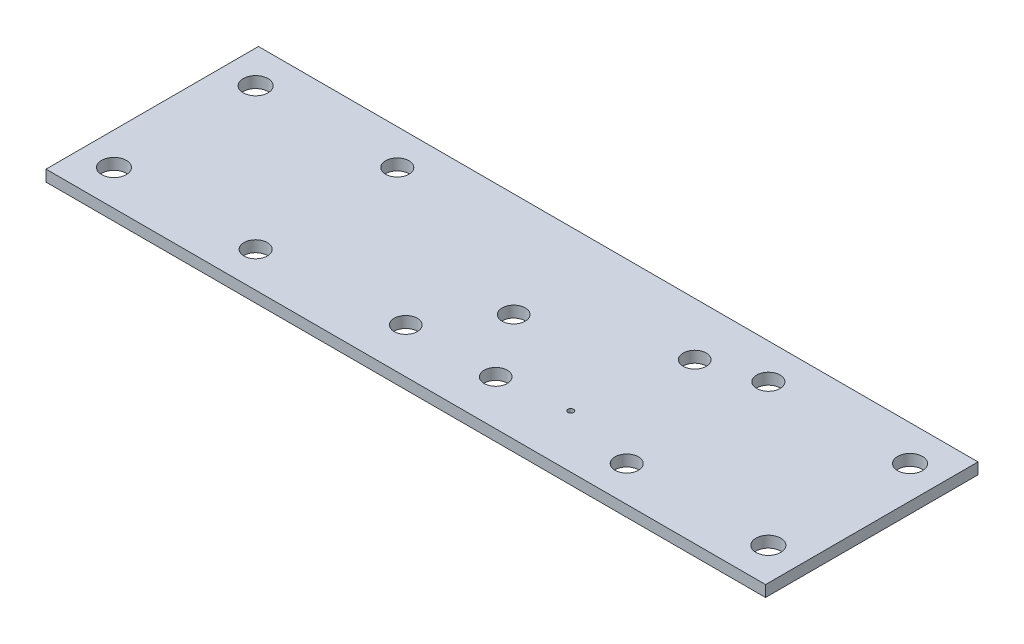
ISO-10303-21;
HEADER;
FILE_DESCRIPTION(('STEP AP214'),'2;1');
FILE_NAME('part.step','',(''),(''),'','','');
FILE_SCHEMA(('AUTOMOTIVE_DESIGN { 1 0 10303 214 1 1 1 1 }'));
ENDSEC;
DATA;
#1=APPLICATION_CONTEXT('core data for automotive mechanical design processes');
#2=APPLICATION_PROTOCOL_DEFINITION('international standard','automotive_design',2000,#1);
#3=PRODUCT_CONTEXT('',#1,'mechanical');
#4=PRODUCT('Part','Part','',(#3));
#5=PRODUCT_RELATED_PRODUCT_CATEGORY('part','',(#4));
#6=PRODUCT_DEFINITION_FORMATION('','',#4);
#7=PRODUCT_DEFINITION_CONTEXT('part definition',#1,'design');
#8=PRODUCT_DEFINITION('design','',#6,#7);
#9=PRODUCT_DEFINITION_SHAPE('','',#8);
#10=(LENGTH_UNIT() NAMED_UNIT(*) SI_UNIT(.MILLI.,.METRE.));
#11=(NAMED_UNIT(*) PLANE_ANGLE_UNIT() SI_UNIT($,.RADIAN.));
#12=(NAMED_UNIT(*) SI_UNIT($,.STERADIAN.) SOLID_ANGLE_UNIT());
#13=UNCERTAINTY_MEASURE_WITH_UNIT(LENGTH_MEASURE(1.E-05),#10,'distance_accuracy_value','');
#14=(GEOMETRIC_REPRESENTATION_CONTEXT(3) GLOBAL_UNCERTAINTY_ASSIGNED_CONTEXT((#13)) GLOBAL_UNIT_ASSIGNED_CONTEXT((#10,
#11,#12)) REPRESENTATION_CONTEXT('',''));
#15=CARTESIAN_POINT('',(0.,0.,0.));
#16=DIRECTION('',(0.,0.,1.));
#17=DIRECTION('',(1.,0.,0.));
#18=AXIS2_PLACEMENT_3D('',#15,#16,#17);
#19=CARTESIAN_POINT('',(0.,3.175,0.));
#20=DIRECTION('',(0.,1.,0.));
#21=DIRECTION('',(0.,0.,1.));
#22=AXIS2_PLACEMENT_3D('',#19,#20,#21);
#23=PLANE('',#22);
#24=CARTESIAN_POINT('',(36.6,3.175,-15.));
#25=DIRECTION('',(0.,1.,0.));
#26=DIRECTION('',(0.,0.,1.));
#27=AXIS2_PLACEMENT_3D('',#24,#25,#26);
#28=CIRCLE('',#27,3.2639);
#29=CARTESIAN_POINT('',(36.6,3.175,-11.7361));
#30=VERTEX_POINT('',#29);
#31=EDGE_CURVE('E184',#30,#30,#28,.T.);
#32=ORIENTED_EDGE('',*,*,#31,.F.);
#33=EDGE_LOOP('',(#32));
#34=FACE_BOUND('',#33,.T.);
#35=CARTESIAN_POINT('',(31.6,3.175,15.));
#36=DIRECTION('',(0.,1.,0.));
#37=DIRECTION('',(0.,0.,1.));
#38=AXIS2_PLACEMENT_3D('',#35,#36,#37);
#39=CIRCLE('',#38,0.793749999999992);
#40=CARTESIAN_POINT('',(31.6,3.175,15.79375));
#41=VERTEX_POINT('',#40);
#42=EDGE_CURVE('E178',#41,#41,#39,.T.);
#43=ORIENTED_EDGE('',*,*,#42,.F.);
#44=EDGE_LOOP('',(#43));
#45=FACE_BOUND('',#44,.T.);
#46=CARTESIAN_POINT('',(12.7,3.175,17.3));
#47=DIRECTION('',(0.,1.,0.));
#48=DIRECTION('',(0.,0.,1.));
#49=AXIS2_PLACEMENT_3D('',#46,#47,#48);
#50=CIRCLE('',#49,3.2639);
#51=CARTESIAN_POINT('',(12.7,3.175,20.5639));
#52=VERTEX_POINT('',#51);
#53=EDGE_CURVE('E173',#52,#52,#50,.T.);
#54=ORIENTED_EDGE('',*,*,#53,.F.);
#55=EDGE_LOOP('',(#54));
#56=FACE_BOUND('',#55,.T.);
#57=CARTESIAN_POINT('',(0.,3.175,-0.479999999999982));
#58=DIRECTION('',(0.,1.,0.));
#59=DIRECTION('',(0.,0.,1.));
#60=AXIS2_PLACEMENT_3D('',#57,#58,#59);
#61=CIRCLE('',#60,3.2639);
#62=CARTESIAN_POINT('',(0.,3.175,2.78390000000002));
#63=VERTEX_POINT('',#62);
#64=EDGE_CURVE('E166',#63,#63,#61,.T.);
#65=ORIENTED_EDGE('',*,*,#64,.F.);
#66=EDGE_LOOP('',(#65));
#67=FACE_BOUND('',#66,.T.);
#68=CARTESIAN_POINT('',(-12.7,3.175,17.3));
#69=DIRECTION('',(0.,1.,0.));
#70=DIRECTION('',(0.,0.,1.));
#71=AXIS2_PLACEMENT_3D('',#68,#69,#70);
#72=CIRCLE('',#71,3.2639);
#73=CARTESIAN_POINT('',(-12.7,3.175,20.5639));
#74=VERTEX_POINT('',#73);
#75=EDGE_CURVE('E160',#74,#74,#72,.T.);
#76=ORIENTED_EDGE('',*,*,#75,.F.);
#77=EDGE_LOOP('',(#76));
#78=FACE_BOUND('',#77,.T.);
#79=CARTESIAN_POINT('',(92.4,3.175,19.9999999999999));
#80=DIRECTION('',(0.,1.,0.));
#81=DIRECTION('',(0.,0.,1.));
#82=AXIS2_PLACEMENT_3D('',#79,#80,#81);
#83=CIRCLE('',#82,3.49999999999999);
#84=CARTESIAN_POINT('',(92.4,3.175,23.4999999999999));
#85=VERTEX_POINT('',#84);
#86=EDGE_CURVE('E145',#85,#85,#83,.T.);
#87=ORIENTED_EDGE('',*,*,#86,.F.);
#88=EDGE_LOOP('',(#87));
#89=FACE_BOUND('',#88,.T.);
#90=CARTESIAN_POINT('',(92.3999999999999,3.175,-20.0000000000001));
#91=DIRECTION('',(0.,1.,0.));
#92=DIRECTION('',(0.,0.,-1.));
#93=AXIS2_PLACEMENT_3D('',#90,#91,#92);
#94=CIRCLE('',#93,3.49999999999999);
#95=CARTESIAN_POINT('',(92.3999999999999,3.175,-23.5000000000001));
#96=VERTEX_POINT('',#95);
#97=EDGE_CURVE('E133',#96,#96,#94,.T.);
#98=ORIENTED_EDGE('',*,*,#97,.F.);
#99=EDGE_LOOP('',(#98));
#100=FACE_BOUND('',#99,.T.);
#101=CARTESIAN_POINT('',(-52.4,3.175,20.));
#102=DIRECTION('',(0.,1.,0.));
#103=DIRECTION('',(0.,0.,-1.));
#104=AXIS2_PLACEMENT_3D('',#101,#102,#103);
#105=CIRCLE('',#104,3.3);
#106=CARTESIAN_POINT('',(-52.4,3.175,16.7));
#107=VERTEX_POINT('',#106);
#108=EDGE_CURVE('E121',#107,#107,#105,.T.);
#109=ORIENTED_EDGE('',*,*,#108,.F.);
#110=EDGE_LOOP('',(#109));
#111=FACE_BOUND('',#110,.T.);
#112=CARTESIAN_POINT('',(-52.4,3.175,-20.));
#113=DIRECTION('',(0.,1.,0.));
#114=DIRECTION('',(0.,0.,1.));
#115=AXIS2_PLACEMENT_3D('',#112,#113,#114);
#116=CIRCLE('',#115,3.3);
#117=CARTESIAN_POINT('',(-52.4,3.175,-16.7));
#118=VERTEX_POINT('',#117);
#119=EDGE_CURVE('E100',#118,#118,#116,.T.);
#120=ORIENTED_EDGE('',*,*,#119,.F.);
#121=EDGE_LOOP('',(#120));
#122=FACE_BOUND('',#121,.T.);
#123=DIRECTION('',(0.,0.,-1.));
#124=VECTOR('',#123,1.);
#125=CARTESIAN_POINT('',(101.6,3.175,-30.));
#126=LINE('',#125,#124);
#127=CARTESIAN_POINT('',(101.6,3.175,30.));
#128=VERTEX_POINT('',#127);
#129=CARTESIAN_POINT('',(101.6,3.175,-30.));
#130=VERTEX_POINT('',#129);
#131=EDGE_CURVE('E85',#128,#130,#126,.T.);
#132=ORIENTED_EDGE('',*,*,#131,.T.);
#133=DIRECTION('',(-1.,0.,0.));
#134=VECTOR('',#133,1.);
#135=CARTESIAN_POINT('',(-101.6,3.175,-30.));
#136=LINE('',#135,#134);
#137=CARTESIAN_POINT('',(-101.6,3.175,-30.));
#138=VERTEX_POINT('',#137);
#139=EDGE_CURVE('E80',#130,#138,#136,.T.);
#140=ORIENTED_EDGE('',*,*,#139,.T.);
#141=DIRECTION('',(0.,0.,1.));
#142=VECTOR('',#141,1.);
#143=CARTESIAN_POINT('',(-101.6,3.175,-30.));
#144=LINE('',#143,#142);
#145=CARTESIAN_POINT('',(-101.6,3.175,30.));
#146=VERTEX_POINT('',#145);
#147=EDGE_CURVE('E83',#138,#146,#144,.T.);
#148=ORIENTED_EDGE('',*,*,#147,.T.);
#149=DIRECTION('',(1.,0.,0.));
#150=VECTOR('',#149,1.);
#151=CARTESIAN_POINT('',(-101.6,3.175,30.));
#152=LINE('',#151,#150);
#153=EDGE_CURVE('E50',#146,#128,#152,.T.);
#154=ORIENTED_EDGE('',*,*,#153,.T.);
#155=EDGE_LOOP('',(#132,#140,#148,#154));
#156=FACE_BOUND('',#155,.T.);
#157=CARTESIAN_POINT('',(-92.4,3.175,20.));
#158=DIRECTION('',(0.,1.,0.));
#159=DIRECTION('',(0.,0.,-1.));
#160=AXIS2_PLACEMENT_3D('',#157,#158,#159);
#161=CIRCLE('',#160,3.49999999999999);
#162=CARTESIAN_POINT('',(-92.4,3.175,16.5));
#163=VERTEX_POINT('',#162);
#164=EDGE_CURVE('E115',#163,#163,#161,.T.);
#165=ORIENTED_EDGE('',*,*,#164,.F.);
#166=EDGE_LOOP('',(#165));
#167=FACE_BOUND('',#166,.T.);
#168=CARTESIAN_POINT('',(-92.4,3.175,-20.));
#169=DIRECTION('',(0.,1.,0.));
#170=DIRECTION('',(0.,0.,1.));
#171=AXIS2_PLACEMENT_3D('',#168,#169,#170);
#172=CIRCLE('',#171,3.49999999999999);
#173=CARTESIAN_POINT('',(-92.4,3.175,-16.5));
#174=VERTEX_POINT('',#173);
#175=EDGE_CURVE('E127',#174,#174,#172,.T.);
#176=ORIENTED_EDGE('',*,*,#175,.F.);
#177=EDGE_LOOP('',(#176));
#178=FACE_BOUND('',#177,.T.);
#179=CARTESIAN_POINT('',(52.4,3.175,19.9999999999999));
#180=DIRECTION('',(0.,1.,0.));
#181=DIRECTION('',(0.,0.,1.));
#182=AXIS2_PLACEMENT_3D('',#179,#180,#181);
#183=CIRCLE('',#182,3.29999999999999);
#184=CARTESIAN_POINT('',(52.4,3.175,23.2999999999999));
#185=VERTEX_POINT('',#184);
#186=EDGE_CURVE('E139',#185,#185,#183,.T.);
#187=ORIENTED_EDGE('',*,*,#186,.F.);
#188=EDGE_LOOP('',(#187));
#189=FACE_BOUND('',#188,.T.);
#190=CARTESIAN_POINT('',(52.4,3.175,-20.0000000000001));
#191=DIRECTION('',(0.,1.,0.));
#192=DIRECTION('',(0.,0.,-1.));
#193=AXIS2_PLACEMENT_3D('',#190,#191,#192);
#194=CIRCLE('',#193,3.30000000000002);
#195=CARTESIAN_POINT('',(52.4,3.175,-23.3000000000001));
#196=VERTEX_POINT('',#195);
#197=EDGE_CURVE('E151',#196,#196,#194,.T.);
#198=ORIENTED_EDGE('',*,*,#197,.F.);
#199=EDGE_LOOP('',(#198));
#200=FACE_BOUND('',#199,.T.);
#201=ADVANCED_FACE('F33',(#34,#45,#56,#67,#78,#89,#100,#111,#122,#156,#167,#178,#189,#200),#23,.T.);
#202=CARTESIAN_POINT('',(0.,0.,0.));
#203=DIRECTION('',(0.,1.,0.));
#204=DIRECTION('',(0.,0.,1.));
#205=AXIS2_PLACEMENT_3D('',#202,#203,#204);
#206=PLANE('',#205);
#207=CARTESIAN_POINT('',(36.6,0.,-15.));
#208=DIRECTION('',(0.,1.,0.));
#209=DIRECTION('',(0.,0.,1.));
#210=AXIS2_PLACEMENT_3D('',#207,#208,#209);
#211=CIRCLE('',#210,3.2639);
#212=CARTESIAN_POINT('',(36.6,0.,-11.7361));
#213=VERTEX_POINT('',#212);
#214=EDGE_CURVE('E181',#213,#213,#211,.T.);
#215=ORIENTED_EDGE('',*,*,#214,.T.);
#216=EDGE_LOOP('',(#215));
#217=FACE_BOUND('',#216,.T.);
#218=CARTESIAN_POINT('',(31.6,0.,15.));
#219=DIRECTION('',(0.,1.,0.));
#220=DIRECTION('',(0.,0.,1.));
#221=AXIS2_PLACEMENT_3D('',#218,#219,#220);
#222=CIRCLE('',#221,0.793749999999992);
#223=CARTESIAN_POINT('',(31.6,0.,15.79375));
#224=VERTEX_POINT('',#223);
#225=EDGE_CURVE('E170',#224,#224,#222,.T.);
#226=ORIENTED_EDGE('',*,*,#225,.T.);
#227=EDGE_LOOP('',(#226));
#228=FACE_BOUND('',#227,.T.);
#229=CARTESIAN_POINT('',(12.7,0.,17.3));
#230=DIRECTION('',(0.,1.,0.));
#231=DIRECTION('',(0.,0.,1.));
#232=AXIS2_PLACEMENT_3D('',#229,#230,#231);
#233=CIRCLE('',#232,3.2639);
#234=CARTESIAN_POINT('',(12.7,0.,20.5639));
#235=VERTEX_POINT('',#234);
#236=EDGE_CURVE('E163',#235,#235,#233,.T.);
#237=ORIENTED_EDGE('',*,*,#236,.T.);
#238=EDGE_LOOP('',(#237));
#239=FACE_BOUND('',#238,.T.);
#240=CARTESIAN_POINT('',(0.,0.,-0.479999999999982));
#241=DIRECTION('',(0.,1.,0.));
#242=DIRECTION('',(0.,0.,1.));
#243=AXIS2_PLACEMENT_3D('',#240,#241,#242);
#244=CIRCLE('',#243,3.2639);
#245=CARTESIAN_POINT('',(0.,0.,2.78390000000002));
#246=VERTEX_POINT('',#245);
#247=EDGE_CURVE('E169',#246,#246,#244,.T.);
#248=ORIENTED_EDGE('',*,*,#247,.T.);
#249=EDGE_LOOP('',(#248));
#250=FACE_BOUND('',#249,.T.);
#251=CARTESIAN_POINT('',(-12.7,0.,17.3));
#252=DIRECTION('',(0.,1.,0.));
#253=DIRECTION('',(0.,0.,1.));
#254=AXIS2_PLACEMENT_3D('',#251,#252,#253);
#255=CIRCLE('',#254,3.2639);
#256=CARTESIAN_POINT('',(-12.7,0.,20.5639));
#257=VERTEX_POINT('',#256);
#258=EDGE_CURVE('E157',#257,#257,#255,.T.);
#259=ORIENTED_EDGE('',*,*,#258,.T.);
#260=EDGE_LOOP('',(#259));
#261=FACE_BOUND('',#260,.T.);
#262=DIRECTION('',(0.,0.,-1.));
#263=VECTOR('',#262,1.);
#264=CARTESIAN_POINT('',(101.6,0.,-30.));
#265=LINE('',#264,#263);
#266=CARTESIAN_POINT('',(101.6,0.,30.));
#267=VERTEX_POINT('',#266);
#268=CARTESIAN_POINT('',(101.6,0.,-30.));
#269=VERTEX_POINT('',#268);
#270=EDGE_CURVE('E97',#267,#269,#265,.T.);
#271=ORIENTED_EDGE('',*,*,#270,.F.);
#272=DIRECTION('',(1.,0.,0.));
#273=VECTOR('',#272,1.);
#274=CARTESIAN_POINT('',(-101.6,0.,30.));
#275=LINE('',#274,#273);
#276=CARTESIAN_POINT('',(-101.6,0.,30.));
#277=VERTEX_POINT('',#276);
#278=EDGE_CURVE('E73',#277,#267,#275,.T.);
#279=ORIENTED_EDGE('',*,*,#278,.F.);
#280=DIRECTION('',(0.,0.,1.));
#281=VECTOR('',#280,1.);
#282=CARTESIAN_POINT('',(-101.6,0.,-30.));
#283=LINE('',#282,#281);
#284=CARTESIAN_POINT('',(-101.6,0.,-30.));
#285=VERTEX_POINT('',#284);
#286=EDGE_CURVE('E67',#285,#277,#283,.T.);
#287=ORIENTED_EDGE('',*,*,#286,.F.);
#288=DIRECTION('',(-1.,0.,0.));
#289=VECTOR('',#288,1.);
#290=CARTESIAN_POINT('',(-101.6,0.,-30.));
#291=LINE('',#290,#289);
#292=EDGE_CURVE('E89',#269,#285,#291,.T.);
#293=ORIENTED_EDGE('',*,*,#292,.F.);
#294=EDGE_LOOP('',(#271,#279,#287,#293));
#295=FACE_BOUND('',#294,.T.);
#296=CARTESIAN_POINT('',(-52.4,0.,-20.));
#297=DIRECTION('',(0.,1.,0.));
#298=DIRECTION('',(0.,0.,1.));
#299=AXIS2_PLACEMENT_3D('',#296,#297,#298);
#300=CIRCLE('',#299,3.3);
#301=CARTESIAN_POINT('',(-52.4,0.,-16.7));
#302=VERTEX_POINT('',#301);
#303=EDGE_CURVE('E112',#302,#302,#300,.T.);
#304=ORIENTED_EDGE('',*,*,#303,.T.);
#305=EDGE_LOOP('',(#304));
#306=FACE_BOUND('',#305,.T.);
#307=CARTESIAN_POINT('',(-92.4,0.,20.));
#308=DIRECTION('',(0.,1.,0.));
#309=DIRECTION('',(0.,0.,-1.));
#310=AXIS2_PLACEMENT_3D('',#307,#308,#309);
#311=CIRCLE('',#310,3.49999999999999);
#312=CARTESIAN_POINT('',(-92.4,0.,16.5));
#313=VERTEX_POINT('',#312);
#314=EDGE_CURVE('E118',#313,#313,#311,.T.);
#315=ORIENTED_EDGE('',*,*,#314,.T.);
#316=EDGE_LOOP('',(#315));
#317=FACE_BOUND('',#316,.T.);
#318=CARTESIAN_POINT('',(-52.4,0.,20.));
#319=DIRECTION('',(0.,1.,0.));
#320=DIRECTION('',(0.,0.,-1.));
#321=AXIS2_PLACEMENT_3D('',#318,#319,#320);
#322=CIRCLE('',#321,3.3);
#323=CARTESIAN_POINT('',(-52.4,0.,16.7));
#324=VERTEX_POINT('',#323);
#325=EDGE_CURVE('E124',#324,#324,#322,.T.);
#326=ORIENTED_EDGE('',*,*,#325,.T.);
#327=EDGE_LOOP('',(#326));
#328=FACE_BOUND('',#327,.T.);
#329=CARTESIAN_POINT('',(-92.4,0.,-20.));
#330=DIRECTION('',(0.,1.,0.));
#331=DIRECTION('',(0.,0.,1.));
#332=AXIS2_PLACEMENT_3D('',#329,#330,#331);
#333=CIRCLE('',#332,3.49999999999999);
#334=CARTESIAN_POINT('',(-92.4,0.,-16.5));
#335=VERTEX_POINT('',#334);
#336=EDGE_CURVE('E130',#335,#335,#333,.T.);
#337=ORIENTED_EDGE('',*,*,#336,.T.);
#338=EDGE_LOOP('',(#337));
#339=FACE_BOUND('',#338,.T.);
#340=CARTESIAN_POINT('',(92.3999999999999,0.,-20.0000000000001));
#341=DIRECTION('',(0.,1.,0.));
#342=DIRECTION('',(0.,0.,-1.));
#343=AXIS2_PLACEMENT_3D('',#340,#341,#342);
#344=CIRCLE('',#343,3.49999999999999);
#345=CARTESIAN_POINT('',(92.3999999999999,0.,-23.5000000000001));
#346=VERTEX_POINT('',#345);
#347=EDGE_CURVE('E136',#346,#346,#344,.T.);
#348=ORIENTED_EDGE('',*,*,#347,.T.);
#349=EDGE_LOOP('',(#348));
#350=FACE_BOUND('',#349,.T.);
#351=CARTESIAN_POINT('',(52.4,0.,19.9999999999999));
#352=DIRECTION('',(0.,1.,0.));
#353=DIRECTION('',(0.,0.,1.));
#354=AXIS2_PLACEMENT_3D('',#351,#352,#353);
#355=CIRCLE('',#354,3.29999999999999);
#356=CARTESIAN_POINT('',(52.4,0.,23.2999999999999));
#357=VERTEX_POINT('',#356);
#358=EDGE_CURVE('E142',#357,#357,#355,.T.);
#359=ORIENTED_EDGE('',*,*,#358,.T.);
#360=EDGE_LOOP('',(#359));
#361=FACE_BOUND('',#360,.T.);
#362=CARTESIAN_POINT('',(92.4,0.,19.9999999999999));
#363=DIRECTION('',(0.,1.,0.));
#364=DIRECTION('',(0.,0.,1.));
#365=AXIS2_PLACEMENT_3D('',#362,#363,#364);
#366=CIRCLE('',#365,3.49999999999999);
#367=CARTESIAN_POINT('',(92.4,0.,23.4999999999999));
#368=VERTEX_POINT('',#367);
#369=EDGE_CURVE('E148',#368,#368,#366,.T.);
#370=ORIENTED_EDGE('',*,*,#369,.T.);
#371=EDGE_LOOP('',(#370));
#372=FACE_BOUND('',#371,.T.);
#373=CARTESIAN_POINT('',(52.4,0.,-20.0000000000001));
#374=DIRECTION('',(0.,1.,0.));
#375=DIRECTION('',(0.,0.,-1.));
#376=AXIS2_PLACEMENT_3D('',#373,#374,#375);
#377=CIRCLE('',#376,3.30000000000002);
#378=CARTESIAN_POINT('',(52.4,0.,-23.3000000000001));
#379=VERTEX_POINT('',#378);
#380=EDGE_CURVE('E154',#379,#379,#377,.T.);
#381=ORIENTED_EDGE('',*,*,#380,.T.);
#382=EDGE_LOOP('',(#381));
#383=FACE_BOUND('',#382,.T.);
#384=ADVANCED_FACE('F108',(#217,#228,#239,#250,#261,#295,#306,#317,#328,#339,#350,#361,#372,
#383),#206,.F.);
#385=CARTESIAN_POINT('',(101.6,3.175,-30.));
#386=DIRECTION('',(-1.,0.,0.));
#387=DIRECTION('',(0.,0.,1.));
#388=AXIS2_PLACEMENT_3D('',#385,#386,#387);
#389=PLANE('',#388);
#390=ORIENTED_EDGE('',*,*,#270,.T.);
#391=DIRECTION('',(0.,-1.,0.));
#392=VECTOR('',#391,1.);
#393=CARTESIAN_POINT('',(101.6,3.175,-30.));
#394=LINE('',#393,#392);
#395=EDGE_CURVE('E11',#130,#269,#394,.T.);
#396=ORIENTED_EDGE('',*,*,#395,.F.);
#397=ORIENTED_EDGE('',*,*,#131,.F.);
#398=DIRECTION('',(0.,-1.,0.));
#399=VECTOR('',#398,1.);
#400=CARTESIAN_POINT('',(101.6,3.175,30.));
#401=LINE('',#400,#399);
#402=EDGE_CURVE('E93',#128,#267,#401,.T.);
#403=ORIENTED_EDGE('',*,*,#402,.T.);
#404=EDGE_LOOP('',(#390,#396,#397,#403));
#405=FACE_BOUND('',#404,.T.);
#406=ADVANCED_FACE('F35',(#405),#389,.F.);
#407=CARTESIAN_POINT('',(-101.6,3.175,-30.));
#408=DIRECTION('',(0.,0.,1.));
#409=DIRECTION('',(1.,0.,0.));
#410=AXIS2_PLACEMENT_3D('',#407,#408,#409);
#411=PLANE('',#410);
#412=ORIENTED_EDGE('',*,*,#292,.T.);
#413=DIRECTION('',(0.,-1.,0.));
#414=VECTOR('',#413,1.);
#415=CARTESIAN_POINT('',(-101.6,3.175,-30.));
#416=LINE('',#415,#414);
#417=EDGE_CURVE('E42',#138,#285,#416,.T.);
#418=ORIENTED_EDGE('',*,*,#417,.F.);
#419=ORIENTED_EDGE('',*,*,#139,.F.);
#420=ORIENTED_EDGE('',*,*,#395,.T.);
#421=EDGE_LOOP('',(#412,#418,#419,#420));
#422=FACE_BOUND('',#421,.T.);
#423=ADVANCED_FACE('F88',(#422),#411,.F.);
#424=CARTESIAN_POINT('',(-101.6,3.175,-30.));
#425=DIRECTION('',(1.,0.,0.));
#426=DIRECTION('',(0.,0.,-1.));
#427=AXIS2_PLACEMENT_3D('',#424,#425,#426);
#428=PLANE('',#427);
#429=ORIENTED_EDGE('',*,*,#286,.T.);
#430=DIRECTION('',(0.,-1.,0.));
#431=VECTOR('',#430,1.);
#432=CARTESIAN_POINT('',(-101.6,3.175,30.));
#433=LINE('',#432,#431);
#434=EDGE_CURVE('E90',#146,#277,#433,.T.);
#435=ORIENTED_EDGE('',*,*,#434,.F.);
#436=ORIENTED_EDGE('',*,*,#147,.F.);
#437=ORIENTED_EDGE('',*,*,#417,.T.);
#438=EDGE_LOOP('',(#429,#435,#436,#437));
#439=FACE_BOUND('',#438,.T.);
#440=ADVANCED_FACE('F91',(#439),#428,.F.);
#441=CARTESIAN_POINT('',(-101.6,3.175,30.));
#442=DIRECTION('',(0.,0.,-1.));
#443=DIRECTION('',(-1.,0.,0.));
#444=AXIS2_PLACEMENT_3D('',#441,#442,#443);
#445=PLANE('',#444);
#446=ORIENTED_EDGE('',*,*,#278,.T.);
#447=ORIENTED_EDGE('',*,*,#402,.F.);
#448=ORIENTED_EDGE('',*,*,#153,.F.);
#449=ORIENTED_EDGE('',*,*,#434,.T.);
#450=EDGE_LOOP('',(#446,#447,#448,#449));
#451=FACE_BOUND('',#450,.T.);
#452=ADVANCED_FACE('F105',(#451),#445,.F.);
#453=CARTESIAN_POINT('',(-52.4,3.175,-20.));
#454=DIRECTION('',(0.,-1.,0.));
#455=DIRECTION('',(0.,0.,-1.));
#456=AXIS2_PLACEMENT_3D('',#453,#454,#455);
#457=CYLINDRICAL_SURFACE('',#456,3.3);
#458=ORIENTED_EDGE('',*,*,#119,.T.);
#459=EDGE_LOOP('',(#458));
#460=FACE_BOUND('',#459,.T.);
#461=ORIENTED_EDGE('',*,*,#303,.F.);
#462=EDGE_LOOP('',(#461));
#463=FACE_BOUND('',#462,.T.);
#464=ADVANCED_FACE('F218',(#460,#463),#457,.F.);
#465=CARTESIAN_POINT('',(-92.4,3.175,20.));
#466=DIRECTION('',(0.,-1.,0.));
#467=DIRECTION('',(0.,0.,-1.));
#468=AXIS2_PLACEMENT_3D('',#465,#466,#467);
#469=CYLINDRICAL_SURFACE('',#468,3.49999999999999);
#470=ORIENTED_EDGE('',*,*,#164,.T.);
#471=EDGE_LOOP('',(#470));
#472=FACE_BOUND('',#471,.T.);
#473=ORIENTED_EDGE('',*,*,#314,.F.);
#474=EDGE_LOOP('',(#473));
#475=FACE_BOUND('',#474,.T.);
#476=ADVANCED_FACE('F221',(#472,#475),#469,.F.);
#477=CARTESIAN_POINT('',(-52.4,3.175,20.));
#478=DIRECTION('',(0.,-1.,0.));
#479=DIRECTION('',(0.,0.,-1.));
#480=AXIS2_PLACEMENT_3D('',#477,#478,#479);
#481=CYLINDRICAL_SURFACE('',#480,3.3);
#482=ORIENTED_EDGE('',*,*,#108,.T.);
#483=EDGE_LOOP('',(#482));
#484=FACE_BOUND('',#483,.T.);
#485=ORIENTED_EDGE('',*,*,#325,.F.);
#486=EDGE_LOOP('',(#485));
#487=FACE_BOUND('',#486,.T.);
#488=ADVANCED_FACE('F269',(#484,#487),#481,.F.);
#489=CARTESIAN_POINT('',(-92.4,3.175,-20.));
#490=DIRECTION('',(0.,-1.,0.));
#491=DIRECTION('',(0.,0.,-1.));
#492=AXIS2_PLACEMENT_3D('',#489,#490,#491);
#493=CYLINDRICAL_SURFACE('',#492,3.49999999999999);
#494=ORIENTED_EDGE('',*,*,#175,.T.);
#495=EDGE_LOOP('',(#494));
#496=FACE_BOUND('',#495,.T.);
#497=ORIENTED_EDGE('',*,*,#336,.F.);
#498=EDGE_LOOP('',(#497));
#499=FACE_BOUND('',#498,.T.);
#500=ADVANCED_FACE('F265',(#496,#499),#493,.F.);
#501=CARTESIAN_POINT('',(92.3999999999999,3.175,-20.0000000000001));
#502=DIRECTION('',(0.,-1.,0.));
#503=DIRECTION('',(0.,0.,-1.));
#504=AXIS2_PLACEMENT_3D('',#501,#502,#503);
#505=CYLINDRICAL_SURFACE('',#504,3.49999999999999);
#506=ORIENTED_EDGE('',*,*,#97,.T.);
#507=EDGE_LOOP('',(#506));
#508=FACE_BOUND('',#507,.T.);
#509=ORIENTED_EDGE('',*,*,#347,.F.);
#510=EDGE_LOOP('',(#509));
#511=FACE_BOUND('',#510,.T.);
#512=ADVANCED_FACE('F261',(#508,#511),#505,.F.);
#513=CARTESIAN_POINT('',(52.4,3.175,19.9999999999999));
#514=DIRECTION('',(0.,-1.,0.));
#515=DIRECTION('',(0.,0.,-1.));
#516=AXIS2_PLACEMENT_3D('',#513,#514,#515);
#517=CYLINDRICAL_SURFACE('',#516,3.29999999999999);
#518=ORIENTED_EDGE('',*,*,#186,.T.);
#519=EDGE_LOOP('',(#518));
#520=FACE_BOUND('',#519,.T.);
#521=ORIENTED_EDGE('',*,*,#358,.F.);
#522=EDGE_LOOP('',(#521));
#523=FACE_BOUND('',#522,.T.);
#524=ADVANCED_FACE('F254',(#520,#523),#517,.F.);
#525=CARTESIAN_POINT('',(92.4,3.175,19.9999999999999));
#526=DIRECTION('',(0.,-1.,0.));
#527=DIRECTION('',(0.,0.,-1.));
#528=AXIS2_PLACEMENT_3D('',#525,#526,#527);
#529=CYLINDRICAL_SURFACE('',#528,3.49999999999999);
#530=ORIENTED_EDGE('',*,*,#86,.T.);
#531=EDGE_LOOP('',(#530));
#532=FACE_BOUND('',#531,.T.);
#533=ORIENTED_EDGE('',*,*,#369,.F.);
#534=EDGE_LOOP('',(#533));
#535=FACE_BOUND('',#534,.T.);
#536=ADVANCED_FACE('F244',(#532,#535),#529,.F.);
#537=CARTESIAN_POINT('',(52.4,3.175,-20.0000000000001));
#538=DIRECTION('',(0.,-1.,0.));
#539=DIRECTION('',(0.,0.,-1.));
#540=AXIS2_PLACEMENT_3D('',#537,#538,#539);
#541=CYLINDRICAL_SURFACE('',#540,3.30000000000002);
#542=ORIENTED_EDGE('',*,*,#197,.T.);
#543=EDGE_LOOP('',(#542));
#544=FACE_BOUND('',#543,.T.);
#545=ORIENTED_EDGE('',*,*,#380,.F.);
#546=EDGE_LOOP('',(#545));
#547=FACE_BOUND('',#546,.T.);
#548=ADVANCED_FACE('F241',(#544,#547),#541,.F.);
#549=CARTESIAN_POINT('',(-12.7,0.,17.3));
#550=DIRECTION('',(0.,1.,0.));
#551=DIRECTION('',(0.,0.,1.));
#552=AXIS2_PLACEMENT_3D('',#549,#550,#551);
#553=CYLINDRICAL_SURFACE('',#552,3.2639);
#554=ORIENTED_EDGE('',*,*,#258,.F.);
#555=EDGE_LOOP('',(#554));
#556=FACE_BOUND('',#555,.T.);
#557=ORIENTED_EDGE('',*,*,#75,.T.);
#558=EDGE_LOOP('',(#557));
#559=FACE_BOUND('',#558,.T.);
#560=ADVANCED_FACE('F243',(#556,#559),#553,.F.);
#561=CARTESIAN_POINT('',(0.,0.,-0.479999999999982));
#562=DIRECTION('',(0.,1.,0.));
#563=DIRECTION('',(0.,0.,1.));
#564=AXIS2_PLACEMENT_3D('',#561,#562,#563);
#565=CYLINDRICAL_SURFACE('',#564,3.2639);
#566=ORIENTED_EDGE('',*,*,#247,.F.);
#567=EDGE_LOOP('',(#566));
#568=FACE_BOUND('',#567,.T.);
#569=ORIENTED_EDGE('',*,*,#64,.T.);
#570=EDGE_LOOP('',(#569));
#571=FACE_BOUND('',#570,.T.);
#572=ADVANCED_FACE('F251',(#568,#571),#565,.F.);
#573=CARTESIAN_POINT('',(12.7,0.,17.3));
#574=DIRECTION('',(0.,1.,0.));
#575=DIRECTION('',(0.,0.,1.));
#576=AXIS2_PLACEMENT_3D('',#573,#574,#575);
#577=CYLINDRICAL_SURFACE('',#576,3.2639);
#578=ORIENTED_EDGE('',*,*,#236,.F.);
#579=EDGE_LOOP('',(#578));
#580=FACE_BOUND('',#579,.T.);
#581=ORIENTED_EDGE('',*,*,#53,.T.);
#582=EDGE_LOOP('',(#581));
#583=FACE_BOUND('',#582,.T.);
#584=ADVANCED_FACE('F302',(#580,#583),#577,.F.);
#585=CARTESIAN_POINT('',(31.6,0.,15.));
#586=DIRECTION('',(0.,1.,0.));
#587=DIRECTION('',(0.,0.,1.));
#588=AXIS2_PLACEMENT_3D('',#585,#586,#587);
#589=CYLINDRICAL_SURFACE('',#588,0.793749999999992);
#590=ORIENTED_EDGE('',*,*,#225,.F.);
#591=EDGE_LOOP('',(#590));
#592=FACE_BOUND('',#591,.T.);
#593=ORIENTED_EDGE('',*,*,#42,.T.);
#594=EDGE_LOOP('',(#593));
#595=FACE_BOUND('',#594,.T.);
#596=ADVANCED_FACE('F195',(#592,#595),#589,.F.);
#597=CARTESIAN_POINT('',(36.6,0.,-15.));
#598=DIRECTION('',(0.,1.,0.));
#599=DIRECTION('',(0.,0.,1.));
#600=AXIS2_PLACEMENT_3D('',#597,#598,#599);
#601=CYLINDRICAL_SURFACE('',#600,3.2639);
#602=ORIENTED_EDGE('',*,*,#214,.F.);
#603=EDGE_LOOP('',(#602));
#604=FACE_BOUND('',#603,.T.);
#605=ORIENTED_EDGE('',*,*,#31,.T.);
#606=EDGE_LOOP('',(#605));
#607=FACE_BOUND('',#606,.T.);
#608=ADVANCED_FACE('F192',(#604,#607),#601,.F.);
#609=CLOSED_SHELL('',(#201,#384,#406,#423,#440,#452,#464,#476,#488,#500,#512,#524,#536,#548,
#560,#572,#584,#596,#608));
#610=MANIFOLD_SOLID_BREP('B2',#609);
#611=ADVANCED_BREP_SHAPE_REPRESENTATION('',(#18,#610),#14);
#612=SHAPE_DEFINITION_REPRESENTATION(#9,#611);
ENDSEC;
END-ISO-10303-21;
